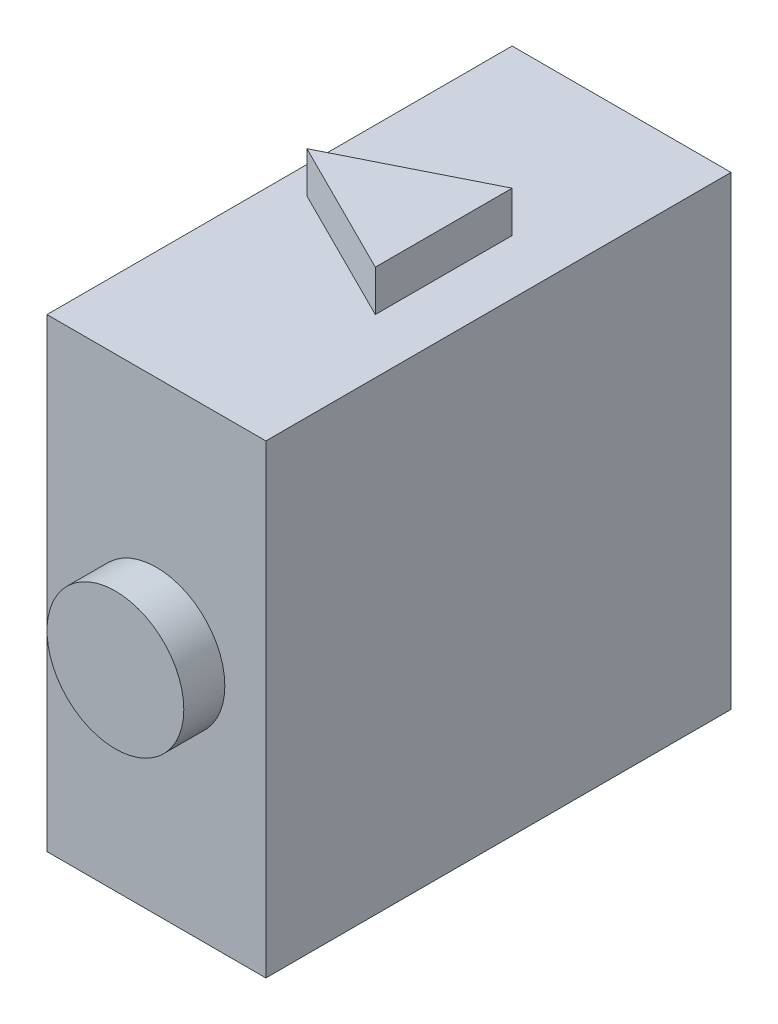
ISO-10303-21;
HEADER;
FILE_DESCRIPTION(('STEP AP214'),'2;1');
FILE_NAME('part.step','',(''),(''),'','','');
FILE_SCHEMA(('AUTOMOTIVE_DESIGN { 1 0 10303 214 1 1 1 1 }'));
ENDSEC;
DATA;
#1=APPLICATION_CONTEXT('core data for automotive mechanical design processes');
#2=APPLICATION_PROTOCOL_DEFINITION('international standard','automotive_design',2000,#1);
#3=PRODUCT_CONTEXT('',#1,'mechanical');
#4=PRODUCT('Part','Part','',(#3));
#5=PRODUCT_RELATED_PRODUCT_CATEGORY('part','',(#4));
#6=PRODUCT_DEFINITION_FORMATION('','',#4);
#7=PRODUCT_DEFINITION_CONTEXT('part definition',#1,'design');
#8=PRODUCT_DEFINITION('design','',#6,#7);
#9=PRODUCT_DEFINITION_SHAPE('','',#8);
#10=(LENGTH_UNIT() NAMED_UNIT(*) SI_UNIT(.MILLI.,.METRE.));
#11=(NAMED_UNIT(*) PLANE_ANGLE_UNIT() SI_UNIT($,.RADIAN.));
#12=(NAMED_UNIT(*) SI_UNIT($,.STERADIAN.) SOLID_ANGLE_UNIT());
#13=UNCERTAINTY_MEASURE_WITH_UNIT(LENGTH_MEASURE(1.E-05),#10,'distance_accuracy_value','');
#14=(GEOMETRIC_REPRESENTATION_CONTEXT(3) GLOBAL_UNCERTAINTY_ASSIGNED_CONTEXT((#13)) GLOBAL_UNIT_ASSIGNED_CONTEXT((#10,
#11,#12)) REPRESENTATION_CONTEXT('',''));
#15=CARTESIAN_POINT('',(0.,0.,0.));
#16=DIRECTION('',(0.,0.,1.));
#17=DIRECTION('',(1.,0.,0.));
#18=AXIS2_PLACEMENT_3D('',#15,#16,#17);
#19=CARTESIAN_POINT('',(0.,40.,0.));
#20=DIRECTION('',(0.,-1.,0.));
#21=DIRECTION('',(0.,0.,-1.));
#22=AXIS2_PLACEMENT_3D('',#19,#20,#21);
#23=PLANE('',#22);
#24=DIRECTION('',(0.,0.,1.));
#25=VECTOR('',#24,1.);
#26=CARTESIAN_POINT('',(-8.,40.,17.));
#27=LINE('',#26,#25);
#28=CARTESIAN_POINT('',(-8.,40.,-17.));
#29=VERTEX_POINT('',#28);
#30=CARTESIAN_POINT('',(-8.,40.,17.));
#31=VERTEX_POINT('',#30);
#32=EDGE_CURVE('E200',#29,#31,#27,.T.);
#33=ORIENTED_EDGE('',*,*,#32,.T.);
#34=DIRECTION('',(1.,0.,0.));
#35=VECTOR('',#34,1.);
#36=CARTESIAN_POINT('',(-8.,40.,17.));
#37=LINE('',#36,#35);
#38=CARTESIAN_POINT('',(8.,40.,17.));
#39=VERTEX_POINT('',#38);
#40=EDGE_CURVE('E204',#31,#39,#37,.T.);
#41=ORIENTED_EDGE('',*,*,#40,.T.);
#42=DIRECTION('',(0.,0.,-1.));
#43=VECTOR('',#42,1.);
#44=CARTESIAN_POINT('',(8.,40.,17.));
#45=LINE('',#44,#43);
#46=CARTESIAN_POINT('',(8.,40.,-17.));
#47=VERTEX_POINT('',#46);
#48=EDGE_CURVE('E208',#39,#47,#45,.T.);
#49=ORIENTED_EDGE('',*,*,#48,.T.);
#50=DIRECTION('',(-1.,0.,0.));
#51=VECTOR('',#50,1.);
#52=CARTESIAN_POINT('',(-8.,40.,-17.));
#53=LINE('',#52,#51);
#54=EDGE_CURVE('E211',#47,#29,#53,.T.);
#55=ORIENTED_EDGE('',*,*,#54,.T.);
#56=EDGE_LOOP('',(#33,#41,#49,#55));
#57=FACE_BOUND('',#56,.T.);
#58=DIRECTION('',(-0.894427190999916,0.,0.447213595499958));
#59=VECTOR('',#58,1.);
#60=CARTESIAN_POINT('',(-6.,40.,0.));
#61=LINE('',#60,#59);
#62=CARTESIAN_POINT('',(4.,40.,-5.));
#63=VERTEX_POINT('',#62);
#64=CARTESIAN_POINT('',(-6.,40.,0.));
#65=VERTEX_POINT('',#64);
#66=EDGE_CURVE('E56',#63,#65,#61,.T.);
#67=ORIENTED_EDGE('',*,*,#66,.F.);
#68=DIRECTION('',(0.,0.,-1.));
#69=VECTOR('',#68,1.);
#70=CARTESIAN_POINT('',(4.,40.,-5.));
#71=LINE('',#70,#69);
#72=CARTESIAN_POINT('',(4.,40.,5.));
#73=VERTEX_POINT('',#72);
#74=EDGE_CURVE('E141',#73,#63,#71,.T.);
#75=ORIENTED_EDGE('',*,*,#74,.F.);
#76=DIRECTION('',(0.894427190999916,0.,0.447213595499958));
#77=VECTOR('',#76,1.);
#78=CARTESIAN_POINT('',(4.,40.,5.));
#79=LINE('',#78,#77);
#80=EDGE_CURVE('E60',#65,#73,#79,.T.);
#81=ORIENTED_EDGE('',*,*,#80,.F.);
#82=EDGE_LOOP('',(#67,#75,#81));
#83=FACE_BOUND('',#82,.T.);
#84=ADVANCED_FACE('F39',(#57,#83),#23,.F.);
#85=CARTESIAN_POINT('',(-8.,40.,17.));
#86=DIRECTION('',(1.,0.,0.));
#87=DIRECTION('',(0.,0.,-1.));
#88=AXIS2_PLACEMENT_3D('',#85,#86,#87);
#89=PLANE('',#88);
#90=DIRECTION('',(0.,0.,1.));
#91=VECTOR('',#90,1.);
#92=CARTESIAN_POINT('',(-8.,36.,12.));
#93=LINE('',#92,#91);
#94=CARTESIAN_POINT('',(-8.,36.,-12.));
#95=VERTEX_POINT('',#94);
#96=CARTESIAN_POINT('',(-8.,36.,12.));
#97=VERTEX_POINT('',#96);
#98=EDGE_CURVE('E169',#95,#97,#93,.T.);
#99=ORIENTED_EDGE('',*,*,#98,.T.);
#100=DIRECTION('',(0.,-1.,0.));
#101=VECTOR('',#100,1.);
#102=CARTESIAN_POINT('',(-8.,10.,12.));
#103=LINE('',#102,#101);
#104=CARTESIAN_POINT('',(-8.,10.,12.));
#105=VERTEX_POINT('',#104);
#106=EDGE_CURVE('E156',#97,#105,#103,.T.);
#107=ORIENTED_EDGE('',*,*,#106,.T.);
#108=DIRECTION('',(0.,0.,-1.));
#109=VECTOR('',#108,1.);
#110=CARTESIAN_POINT('',(-8.,10.,12.));
#111=LINE('',#110,#109);
#112=CARTESIAN_POINT('',(-8.,10.,-12.));
#113=VERTEX_POINT('',#112);
#114=EDGE_CURVE('E160',#105,#113,#111,.T.);
#115=ORIENTED_EDGE('',*,*,#114,.T.);
#116=DIRECTION('',(0.,1.,0.));
#117=VECTOR('',#116,1.);
#118=CARTESIAN_POINT('',(-8.,10.,-12.));
#119=LINE('',#118,#117);
#120=EDGE_CURVE('E165',#113,#95,#119,.T.);
#121=ORIENTED_EDGE('',*,*,#120,.T.);
#122=EDGE_LOOP('',(#99,#107,#115,#121));
#123=FACE_BOUND('',#122,.T.);
#124=DIRECTION('',(0.,0.,1.));
#125=VECTOR('',#124,1.);
#126=CARTESIAN_POINT('',(-8.,6.,17.));
#127=LINE('',#126,#125);
#128=CARTESIAN_POINT('',(-8.,6.,-17.));
#129=VERTEX_POINT('',#128);
#130=CARTESIAN_POINT('',(-8.,6.,17.));
#131=VERTEX_POINT('',#130);
#132=EDGE_CURVE('E191',#129,#131,#127,.T.);
#133=ORIENTED_EDGE('',*,*,#132,.T.);
#134=DIRECTION('',(0.,-1.,0.));
#135=VECTOR('',#134,1.);
#136=CARTESIAN_POINT('',(-8.,40.,17.));
#137=LINE('',#136,#135);
#138=EDGE_CURVE('E43',#31,#131,#137,.T.);
#139=ORIENTED_EDGE('',*,*,#138,.F.);
#140=ORIENTED_EDGE('',*,*,#32,.F.);
#141=DIRECTION('',(0.,-1.,0.));
#142=VECTOR('',#141,1.);
#143=CARTESIAN_POINT('',(-8.,40.,-17.));
#144=LINE('',#143,#142);
#145=EDGE_CURVE('E214',#29,#129,#144,.T.);
#146=ORIENTED_EDGE('',*,*,#145,.T.);
#147=EDGE_LOOP('',(#133,#139,#140,#146));
#148=FACE_BOUND('',#147,.T.);
#149=ADVANCED_FACE('F41',(#123,#148),#89,.F.);
#150=CARTESIAN_POINT('',(-8.,40.,17.));
#151=DIRECTION('',(0.,0.,-1.));
#152=DIRECTION('',(-1.,0.,0.));
#153=AXIS2_PLACEMENT_3D('',#150,#151,#152);
#154=PLANE('',#153);
#155=CARTESIAN_POINT('',(0.,23.,17.));
#156=DIRECTION('',(0.,0.,1.));
#157=DIRECTION('',(1.,0.,0.));
#158=AXIS2_PLACEMENT_3D('',#155,#156,#157);
#159=CIRCLE('',#158,5.);
#160=CARTESIAN_POINT('',(5.,23.,17.));
#161=VERTEX_POINT('',#160);
#162=EDGE_CURVE('E11',#161,#161,#159,.T.);
#163=ORIENTED_EDGE('',*,*,#162,.F.);
#164=EDGE_LOOP('',(#163));
#165=FACE_BOUND('',#164,.T.);
#166=DIRECTION('',(1.,0.,0.));
#167=VECTOR('',#166,1.);
#168=CARTESIAN_POINT('',(-8.,6.,17.));
#169=LINE('',#168,#167);
#170=CARTESIAN_POINT('',(8.,6.,17.));
#171=VERTEX_POINT('',#170);
#172=EDGE_CURVE('E218',#131,#171,#169,.T.);
#173=ORIENTED_EDGE('',*,*,#172,.T.);
#174=DIRECTION('',(0.,-1.,0.));
#175=VECTOR('',#174,1.);
#176=CARTESIAN_POINT('',(8.,40.,17.));
#177=LINE('',#176,#175);
#178=EDGE_CURVE('E232',#39,#171,#177,.T.);
#179=ORIENTED_EDGE('',*,*,#178,.F.);
#180=ORIENTED_EDGE('',*,*,#40,.F.);
#181=ORIENTED_EDGE('',*,*,#138,.T.);
#182=EDGE_LOOP('',(#173,#179,#180,#181));
#183=FACE_BOUND('',#182,.T.);
#184=ADVANCED_FACE('F243',(#165,#183),#154,.F.);
#185=CARTESIAN_POINT('',(8.,40.,17.));
#186=DIRECTION('',(-1.,0.,0.));
#187=DIRECTION('',(0.,0.,1.));
#188=AXIS2_PLACEMENT_3D('',#185,#186,#187);
#189=PLANE('',#188);
#190=DIRECTION('',(0.,0.,-1.));
#191=VECTOR('',#190,1.);
#192=CARTESIAN_POINT('',(8.,6.,17.));
#193=LINE('',#192,#191);
#194=CARTESIAN_POINT('',(8.,6.,-17.));
#195=VERTEX_POINT('',#194);
#196=EDGE_CURVE('E221',#171,#195,#193,.T.);
#197=ORIENTED_EDGE('',*,*,#196,.T.);
#198=DIRECTION('',(0.,-1.,0.));
#199=VECTOR('',#198,1.);
#200=CARTESIAN_POINT('',(8.,40.,-17.));
#201=LINE('',#200,#199);
#202=EDGE_CURVE('E229',#47,#195,#201,.T.);
#203=ORIENTED_EDGE('',*,*,#202,.F.);
#204=ORIENTED_EDGE('',*,*,#48,.F.);
#205=ORIENTED_EDGE('',*,*,#178,.T.);
#206=EDGE_LOOP('',(#197,#203,#204,#205));
#207=FACE_BOUND('',#206,.T.);
#208=ADVANCED_FACE('F252',(#207),#189,.F.);
#209=CARTESIAN_POINT('',(-8.,40.,-17.));
#210=DIRECTION('',(0.,0.,1.));
#211=DIRECTION('',(1.,0.,0.));
#212=AXIS2_PLACEMENT_3D('',#209,#210,#211);
#213=PLANE('',#212);
#214=DIRECTION('',(-1.,0.,0.));
#215=VECTOR('',#214,1.);
#216=CARTESIAN_POINT('',(-8.,6.,-17.));
#217=LINE('',#216,#215);
#218=EDGE_CURVE('E205',#195,#129,#217,.T.);
#219=ORIENTED_EDGE('',*,*,#218,.T.);
#220=ORIENTED_EDGE('',*,*,#145,.F.);
#221=ORIENTED_EDGE('',*,*,#54,.F.);
#222=ORIENTED_EDGE('',*,*,#202,.T.);
#223=EDGE_LOOP('',(#219,#220,#221,#222));
#224=FACE_BOUND('',#223,.T.);
#225=ADVANCED_FACE('F255',(#224),#213,.F.);
#226=CARTESIAN_POINT('',(0.,6.,0.));
#227=DIRECTION('',(0.,-1.,0.));
#228=DIRECTION('',(0.,0.,-1.));
#229=AXIS2_PLACEMENT_3D('',#226,#227,#228);
#230=PLANE('',#229);
#231=ORIENTED_EDGE('',*,*,#132,.F.);
#232=ORIENTED_EDGE('',*,*,#218,.F.);
#233=ORIENTED_EDGE('',*,*,#196,.F.);
#234=ORIENTED_EDGE('',*,*,#172,.F.);
#235=EDGE_LOOP('',(#231,#232,#233,#234));
#236=FACE_BOUND('',#235,.T.);
#237=ADVANCED_FACE('F250',(#236),#230,.T.);
#238=CARTESIAN_POINT('',(-8.,10.,12.));
#239=DIRECTION('',(0.,0.,1.));
#240=DIRECTION('',(1.,0.,0.));
#241=AXIS2_PLACEMENT_3D('',#238,#239,#240);
#242=PLANE('',#241);
#243=DIRECTION('',(0.,-1.,0.));
#244=VECTOR('',#243,1.);
#245=CARTESIAN_POINT('',(-2.,10.,12.));
#246=LINE('',#245,#244);
#247=CARTESIAN_POINT('',(-2.,36.,12.));
#248=VERTEX_POINT('',#247);
#249=CARTESIAN_POINT('',(-2.,10.,12.));
#250=VERTEX_POINT('',#249);
#251=EDGE_CURVE('E150',#248,#250,#246,.T.);
#252=ORIENTED_EDGE('',*,*,#251,.T.);
#253=DIRECTION('',(1.,0.,0.));
#254=VECTOR('',#253,1.);
#255=CARTESIAN_POINT('',(-8.,10.,12.));
#256=LINE('',#255,#254);
#257=EDGE_CURVE('E173',#105,#250,#256,.T.);
#258=ORIENTED_EDGE('',*,*,#257,.F.);
#259=ORIENTED_EDGE('',*,*,#106,.F.);
#260=DIRECTION('',(1.,0.,0.));
#261=VECTOR('',#260,1.);
#262=CARTESIAN_POINT('',(-8.,36.,12.));
#263=LINE('',#262,#261);
#264=EDGE_CURVE('E188',#97,#248,#263,.T.);
#265=ORIENTED_EDGE('',*,*,#264,.T.);
#266=EDGE_LOOP('',(#252,#258,#259,#265));
#267=FACE_BOUND('',#266,.T.);
#268=ADVANCED_FACE('F265',(#267),#242,.F.);
#269=CARTESIAN_POINT('',(-8.,36.,12.));
#270=DIRECTION('',(0.,1.,0.));
#271=DIRECTION('',(0.,0.,1.));
#272=AXIS2_PLACEMENT_3D('',#269,#270,#271);
#273=PLANE('',#272);
#274=DIRECTION('',(0.,0.,1.));
#275=VECTOR('',#274,1.);
#276=CARTESIAN_POINT('',(-2.,36.,12.));
#277=LINE('',#276,#275);
#278=CARTESIAN_POINT('',(-2.,36.,-12.));
#279=VERTEX_POINT('',#278);
#280=EDGE_CURVE('E161',#279,#248,#277,.T.);
#281=ORIENTED_EDGE('',*,*,#280,.T.);
#282=ORIENTED_EDGE('',*,*,#264,.F.);
#283=ORIENTED_EDGE('',*,*,#98,.F.);
#284=DIRECTION('',(1.,0.,0.));
#285=VECTOR('',#284,1.);
#286=CARTESIAN_POINT('',(-8.,36.,-12.));
#287=LINE('',#286,#285);
#288=EDGE_CURVE('E192',#95,#279,#287,.T.);
#289=ORIENTED_EDGE('',*,*,#288,.T.);
#290=EDGE_LOOP('',(#281,#282,#283,#289));
#291=FACE_BOUND('',#290,.T.);
#292=ADVANCED_FACE('F296',(#291),#273,.F.);
#293=CARTESIAN_POINT('',(-8.,10.,-12.));
#294=DIRECTION('',(0.,0.,-1.));
#295=DIRECTION('',(-1.,0.,0.));
#296=AXIS2_PLACEMENT_3D('',#293,#294,#295);
#297=PLANE('',#296);
#298=DIRECTION('',(0.,1.,0.));
#299=VECTOR('',#298,1.);
#300=CARTESIAN_POINT('',(-2.,10.,-12.));
#301=LINE('',#300,#299);
#302=CARTESIAN_POINT('',(-2.,10.,-12.));
#303=VERTEX_POINT('',#302);
#304=EDGE_CURVE('E181',#303,#279,#301,.T.);
#305=ORIENTED_EDGE('',*,*,#304,.T.);
#306=ORIENTED_EDGE('',*,*,#288,.F.);
#307=ORIENTED_EDGE('',*,*,#120,.F.);
#308=DIRECTION('',(1.,0.,0.));
#309=VECTOR('',#308,1.);
#310=CARTESIAN_POINT('',(-8.,10.,-12.));
#311=LINE('',#310,#309);
#312=EDGE_CURVE('E195',#113,#303,#311,.T.);
#313=ORIENTED_EDGE('',*,*,#312,.T.);
#314=EDGE_LOOP('',(#305,#306,#307,#313));
#315=FACE_BOUND('',#314,.T.);
#316=ADVANCED_FACE('F299',(#315),#297,.F.);
#317=CARTESIAN_POINT('',(-8.,10.,12.));
#318=DIRECTION('',(0.,-1.,0.));
#319=DIRECTION('',(0.,0.,-1.));
#320=AXIS2_PLACEMENT_3D('',#317,#318,#319);
#321=PLANE('',#320);
#322=DIRECTION('',(0.,0.,-1.));
#323=VECTOR('',#322,1.);
#324=CARTESIAN_POINT('',(-2.,10.,12.));
#325=LINE('',#324,#323);
#326=EDGE_CURVE('E177',#250,#303,#325,.T.);
#327=ORIENTED_EDGE('',*,*,#326,.T.);
#328=ORIENTED_EDGE('',*,*,#312,.F.);
#329=ORIENTED_EDGE('',*,*,#114,.F.);
#330=ORIENTED_EDGE('',*,*,#257,.T.);
#331=EDGE_LOOP('',(#327,#328,#329,#330));
#332=FACE_BOUND('',#331,.T.);
#333=ADVANCED_FACE('F290',(#332),#321,.F.);
#334=CARTESIAN_POINT('',(-2.,0.,0.));
#335=DIRECTION('',(-1.,0.,0.));
#336=DIRECTION('',(0.,0.,1.));
#337=AXIS2_PLACEMENT_3D('',#334,#335,#336);
#338=PLANE('',#337);
#339=ORIENTED_EDGE('',*,*,#251,.F.);
#340=ORIENTED_EDGE('',*,*,#280,.F.);
#341=ORIENTED_EDGE('',*,*,#304,.F.);
#342=ORIENTED_EDGE('',*,*,#326,.F.);
#343=EDGE_LOOP('',(#339,#340,#341,#342));
#344=FACE_BOUND('',#343,.T.);
#345=ADVANCED_FACE('F281',(#344),#338,.T.);
#346=CARTESIAN_POINT('',(0.,23.,20.));
#347=DIRECTION('',(0.,0.,-1.));
#348=DIRECTION('',(-1.,0.,0.));
#349=AXIS2_PLACEMENT_3D('',#346,#347,#348);
#350=CYLINDRICAL_SURFACE('',#349,5.);
#351=CARTESIAN_POINT('',(0.,23.,20.));
#352=DIRECTION('',(0.,0.,1.));
#353=DIRECTION('',(1.,0.,0.));
#354=AXIS2_PLACEMENT_3D('',#351,#352,#353);
#355=CIRCLE('',#354,5.);
#356=CARTESIAN_POINT('',(5.,23.,20.));
#357=VERTEX_POINT('',#356);
#358=EDGE_CURVE('E145',#357,#357,#355,.T.);
#359=ORIENTED_EDGE('',*,*,#358,.F.);
#360=EDGE_LOOP('',(#359));
#361=FACE_BOUND('',#360,.T.);
#362=ORIENTED_EDGE('',*,*,#162,.T.);
#363=EDGE_LOOP('',(#362));
#364=FACE_BOUND('',#363,.T.);
#365=ADVANCED_FACE('F278',(#361,#364),#350,.T.);
#366=CARTESIAN_POINT('',(0.,23.,20.));
#367=DIRECTION('',(0.,0.,1.));
#368=DIRECTION('',(1.,0.,0.));
#369=AXIS2_PLACEMENT_3D('',#366,#367,#368);
#370=PLANE('',#369);
#371=ORIENTED_EDGE('',*,*,#358,.T.);
#372=EDGE_LOOP('',(#371));
#373=FACE_BOUND('',#372,.T.);
#374=ADVANCED_FACE('F280',(#373),#370,.T.);
#375=CARTESIAN_POINT('',(-6.,43.,0.));
#376=DIRECTION('',(0.447213595499958,0.,0.894427190999916));
#377=DIRECTION('',(0.894427190999916,0.,-0.447213595499958));
#378=AXIS2_PLACEMENT_3D('',#375,#376,#377);
#379=PLANE('',#378);
#380=ORIENTED_EDGE('',*,*,#66,.T.);
#381=DIRECTION('',(0.,-1.,0.));
#382=VECTOR('',#381,1.);
#383=CARTESIAN_POINT('',(-6.,43.,0.));
#384=LINE('',#383,#382);
#385=CARTESIAN_POINT('',(-6.,43.,0.));
#386=VERTEX_POINT('',#385);
#387=EDGE_CURVE('E126',#386,#65,#384,.T.);
#388=ORIENTED_EDGE('',*,*,#387,.F.);
#389=DIRECTION('',(-0.894427190999916,0.,0.447213595499958));
#390=VECTOR('',#389,1.);
#391=CARTESIAN_POINT('',(-6.,43.,0.));
#392=LINE('',#391,#390);
#393=CARTESIAN_POINT('',(4.,43.,-5.));
#394=VERTEX_POINT('',#393);
#395=EDGE_CURVE('E133',#394,#386,#392,.T.);
#396=ORIENTED_EDGE('',*,*,#395,.F.);
#397=DIRECTION('',(0.,-1.,0.));
#398=VECTOR('',#397,1.);
#399=CARTESIAN_POINT('',(4.,43.,-5.));
#400=LINE('',#399,#398);
#401=EDGE_CURVE('E152',#394,#63,#400,.T.);
#402=ORIENTED_EDGE('',*,*,#401,.T.);
#403=EDGE_LOOP('',(#380,#388,#396,#402));
#404=FACE_BOUND('',#403,.T.);
#405=ADVANCED_FACE('F143',(#404),#379,.F.);
#406=CARTESIAN_POINT('',(4.,43.,5.));
#407=DIRECTION('',(0.447213595499958,0.,-0.894427190999916));
#408=DIRECTION('',(-0.894427190999916,0.,-0.447213595499958));
#409=AXIS2_PLACEMENT_3D('',#406,#407,#408);
#410=PLANE('',#409);
#411=ORIENTED_EDGE('',*,*,#80,.T.);
#412=DIRECTION('',(0.,-1.,0.));
#413=VECTOR('',#412,1.);
#414=CARTESIAN_POINT('',(4.,43.,5.));
#415=LINE('',#414,#413);
#416=CARTESIAN_POINT('',(4.,43.,5.));
#417=VERTEX_POINT('',#416);
#418=EDGE_CURVE('E128',#417,#73,#415,.T.);
#419=ORIENTED_EDGE('',*,*,#418,.F.);
#420=DIRECTION('',(0.894427190999916,0.,0.447213595499958));
#421=VECTOR('',#420,1.);
#422=CARTESIAN_POINT('',(4.,43.,5.));
#423=LINE('',#422,#421);
#424=EDGE_CURVE('E122',#386,#417,#423,.T.);
#425=ORIENTED_EDGE('',*,*,#424,.F.);
#426=ORIENTED_EDGE('',*,*,#387,.T.);
#427=EDGE_LOOP('',(#411,#419,#425,#426));
#428=FACE_BOUND('',#427,.T.);
#429=ADVANCED_FACE('F124',(#428),#410,.F.);
#430=CARTESIAN_POINT('',(4.,43.,-5.));
#431=DIRECTION('',(-1.,0.,0.));
#432=DIRECTION('',(0.,0.,1.));
#433=AXIS2_PLACEMENT_3D('',#430,#431,#432);
#434=PLANE('',#433);
#435=ORIENTED_EDGE('',*,*,#74,.T.);
#436=ORIENTED_EDGE('',*,*,#401,.F.);
#437=DIRECTION('',(0.,0.,-1.));
#438=VECTOR('',#437,1.);
#439=CARTESIAN_POINT('',(4.,43.,-5.));
#440=LINE('',#439,#438);
#441=EDGE_CURVE('E132',#417,#394,#440,.T.);
#442=ORIENTED_EDGE('',*,*,#441,.F.);
#443=ORIENTED_EDGE('',*,*,#418,.T.);
#444=EDGE_LOOP('',(#435,#436,#442,#443));
#445=FACE_BOUND('',#444,.T.);
#446=ADVANCED_FACE('F376',(#445),#434,.F.);
#447=CARTESIAN_POINT('',(0.,43.,0.));
#448=DIRECTION('',(0.,-1.,0.));
#449=DIRECTION('',(0.,0.,-1.));
#450=AXIS2_PLACEMENT_3D('',#447,#448,#449);
#451=PLANE('',#450);
#452=ORIENTED_EDGE('',*,*,#395,.T.);
#453=ORIENTED_EDGE('',*,*,#424,.T.);
#454=ORIENTED_EDGE('',*,*,#441,.T.);
#455=EDGE_LOOP('',(#452,#453,#454));
#456=FACE_BOUND('',#455,.T.);
#457=ADVANCED_FACE('F136',(#456),#451,.F.);
#458=CLOSED_SHELL('',(#84,#149,#184,#208,#225,#237,#268,#292,#316,#333,#345,#365,#374,#405,#429,
#446,#457));
#459=MANIFOLD_SOLID_BREP('B2',#458);
#460=ADVANCED_BREP_SHAPE_REPRESENTATION('',(#18,#459),#14);
#461=SHAPE_DEFINITION_REPRESENTATION(#9,#460);
ENDSEC;
END-ISO-10303-21;
